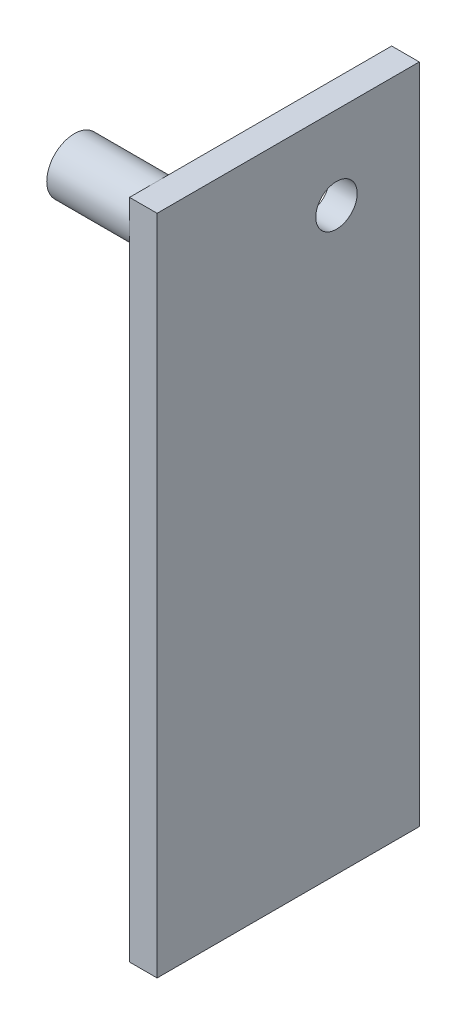
ISO-10303-21;
HEADER;
FILE_DESCRIPTION(('STEP AP214'),'2;1');
FILE_NAME('part.step','',(''),(''),'','','');
FILE_SCHEMA(('AUTOMOTIVE_DESIGN { 1 0 10303 214 1 1 1 1 }'));
ENDSEC;
DATA;
#1=APPLICATION_CONTEXT('core data for automotive mechanical design processes');
#2=APPLICATION_PROTOCOL_DEFINITION('international standard','automotive_design',2000,#1);
#3=PRODUCT_CONTEXT('',#1,'mechanical');
#4=PRODUCT('Part','Part','',(#3));
#5=PRODUCT_RELATED_PRODUCT_CATEGORY('part','',(#4));
#6=PRODUCT_DEFINITION_FORMATION('','',#4);
#7=PRODUCT_DEFINITION_CONTEXT('part definition',#1,'design');
#8=PRODUCT_DEFINITION('design','',#6,#7);
#9=PRODUCT_DEFINITION_SHAPE('','',#8);
#10=(LENGTH_UNIT() NAMED_UNIT(*) SI_UNIT(.MILLI.,.METRE.));
#11=(NAMED_UNIT(*) PLANE_ANGLE_UNIT() SI_UNIT($,.RADIAN.));
#12=(NAMED_UNIT(*) SI_UNIT($,.STERADIAN.) SOLID_ANGLE_UNIT());
#13=UNCERTAINTY_MEASURE_WITH_UNIT(LENGTH_MEASURE(1.E-05),#10,'distance_accuracy_value','');
#14=(GEOMETRIC_REPRESENTATION_CONTEXT(3) GLOBAL_UNCERTAINTY_ASSIGNED_CONTEXT((#13)) GLOBAL_UNIT_ASSIGNED_CONTEXT((#10,
#11,#12)) REPRESENTATION_CONTEXT('',''));
#15=CARTESIAN_POINT('',(0.,0.,0.));
#16=DIRECTION('',(0.,0.,1.));
#17=DIRECTION('',(1.,0.,0.));
#18=AXIS2_PLACEMENT_3D('',#15,#16,#17);
#19=CARTESIAN_POINT('',(0.,0.,0.));
#20=DIRECTION('',(-1.,0.,0.));
#21=DIRECTION('',(0.,0.,1.));
#22=AXIS2_PLACEMENT_3D('',#19,#20,#21);
#23=PLANE('',#22);
#24=CARTESIAN_POINT('',(0.,46.,17.));
#25=DIRECTION('',(-1.,0.,0.));
#26=DIRECTION('',(0.,0.,1.));
#27=AXIS2_PLACEMENT_3D('',#24,#25,#26);
#28=CIRCLE('',#27,2.);
#29=CARTESIAN_POINT('',(0.,46.,19.));
#30=VERTEX_POINT('',#29);
#31=CARTESIAN_POINT('',(0.,48.,17.));
#32=VERTEX_POINT('',#31);
#33=EDGE_CURVE('E50',#30,#32,#28,.T.);
#34=ORIENTED_EDGE('',*,*,#33,.F.);
#35=DIRECTION('',(0.,-1.,0.));
#36=VECTOR('',#35,1.);
#37=CARTESIAN_POINT('',(0.,0.,19.));
#38=LINE('',#37,#36);
#39=CARTESIAN_POINT('',(0.,48.,19.));
#40=VERTEX_POINT('',#39);
#41=EDGE_CURVE('E135',#40,#30,#38,.T.);
#42=ORIENTED_EDGE('',*,*,#41,.F.);
#43=DIRECTION('',(0.,0.,1.));
#44=VECTOR('',#43,1.);
#45=CARTESIAN_POINT('',(0.,48.,0.));
#46=LINE('',#45,#44);
#47=EDGE_CURVE('E103',#32,#40,#46,.T.);
#48=ORIENTED_EDGE('',*,*,#47,.F.);
#49=EDGE_LOOP('',(#34,#42,#48));
#50=FACE_BOUND('',#49,.T.);
#51=ADVANCED_FACE('F39',(#50),#23,.T.);
#52=CARTESIAN_POINT('',(0.,2.,2.));
#53=DIRECTION('',(-1.,0.,0.));
#54=DIRECTION('',(0.,0.,1.));
#55=AXIS2_PLACEMENT_3D('',#52,#53,#54);
#56=CIRCLE('',#55,2.);
#57=CARTESIAN_POINT('',(0.,2.,0.));
#58=VERTEX_POINT('',#57);
#59=CARTESIAN_POINT('',(0.,0.,2.));
#60=VERTEX_POINT('',#59);
#61=EDGE_CURVE('E110',#58,#60,#56,.T.);
#62=ORIENTED_EDGE('',*,*,#61,.F.);
#63=DIRECTION('',(0.,1.,0.));
#64=VECTOR('',#63,1.);
#65=CARTESIAN_POINT('',(0.,0.,0.));
#66=LINE('',#65,#64);
#67=CARTESIAN_POINT('',(0.,0.,0.));
#68=VERTEX_POINT('',#67);
#69=EDGE_CURVE('E95',#68,#58,#66,.T.);
#70=ORIENTED_EDGE('',*,*,#69,.F.);
#71=DIRECTION('',(0.,0.,-1.));
#72=VECTOR('',#71,1.);
#73=CARTESIAN_POINT('',(0.,0.,0.));
#74=LINE('',#73,#72);
#75=EDGE_CURVE('E112',#60,#68,#74,.T.);
#76=ORIENTED_EDGE('',*,*,#75,.F.);
#77=EDGE_LOOP('',(#62,#70,#76));
#78=FACE_BOUND('',#77,.T.);
#79=ADVANCED_FACE('F111',(#78),#23,.T.);
#80=CARTESIAN_POINT('',(2.,0.,0.));
#81=DIRECTION('',(0.,1.,0.));
#82=DIRECTION('',(0.,0.,1.));
#83=AXIS2_PLACEMENT_3D('',#80,#81,#82);
#84=PLANE('',#83);
#85=CARTESIAN_POINT('',(0.,0.,19.));
#86=VERTEX_POINT('',#85);
#87=EDGE_CURVE('E108',#86,#60,#74,.T.);
#88=ORIENTED_EDGE('',*,*,#87,.T.);
#89=ORIENTED_EDGE('',*,*,#75,.T.);
#90=DIRECTION('',(-1.,0.,0.));
#91=VECTOR('',#90,1.);
#92=CARTESIAN_POINT('',(2.,0.,0.));
#93=LINE('',#92,#91);
#94=CARTESIAN_POINT('',(2.,0.,0.));
#95=VERTEX_POINT('',#94);
#96=EDGE_CURVE('E43',#95,#68,#93,.T.);
#97=ORIENTED_EDGE('',*,*,#96,.F.);
#98=DIRECTION('',(0.,0.,-1.));
#99=VECTOR('',#98,1.);
#100=CARTESIAN_POINT('',(2.,0.,0.));
#101=LINE('',#100,#99);
#102=CARTESIAN_POINT('',(2.,0.,19.));
#103=VERTEX_POINT('',#102);
#104=EDGE_CURVE('E131',#103,#95,#101,.T.);
#105=ORIENTED_EDGE('',*,*,#104,.F.);
#106=DIRECTION('',(-1.,0.,0.));
#107=VECTOR('',#106,1.);
#108=CARTESIAN_POINT('',(2.,0.,19.));
#109=LINE('',#108,#107);
#110=EDGE_CURVE('E141',#103,#86,#109,.T.);
#111=ORIENTED_EDGE('',*,*,#110,.T.);
#112=EDGE_LOOP('',(#88,#89,#97,#105,#111));
#113=FACE_BOUND('',#112,.T.);
#114=ADVANCED_FACE('F41',(#113),#84,.F.);
#115=CARTESIAN_POINT('',(2.,0.,0.));
#116=DIRECTION('',(0.,0.,1.));
#117=DIRECTION('',(1.,0.,0.));
#118=AXIS2_PLACEMENT_3D('',#115,#116,#117);
#119=PLANE('',#118);
#120=ORIENTED_EDGE('',*,*,#69,.T.);
#121=CARTESIAN_POINT('',(0.,48.,0.));
#122=VERTEX_POINT('',#121);
#123=EDGE_CURVE('E98',#58,#122,#66,.T.);
#124=ORIENTED_EDGE('',*,*,#123,.T.);
#125=DIRECTION('',(-1.,0.,0.));
#126=VECTOR('',#125,1.);
#127=CARTESIAN_POINT('',(2.,48.,0.));
#128=LINE('',#127,#126);
#129=CARTESIAN_POINT('',(2.,48.,0.));
#130=VERTEX_POINT('',#129);
#131=EDGE_CURVE('E119',#130,#122,#128,.T.);
#132=ORIENTED_EDGE('',*,*,#131,.F.);
#133=DIRECTION('',(0.,1.,0.));
#134=VECTOR('',#133,1.);
#135=CARTESIAN_POINT('',(2.,0.,0.));
#136=LINE('',#135,#134);
#137=EDGE_CURVE('E134',#95,#130,#136,.T.);
#138=ORIENTED_EDGE('',*,*,#137,.F.);
#139=ORIENTED_EDGE('',*,*,#96,.T.);
#140=EDGE_LOOP('',(#120,#124,#132,#138,#139));
#141=FACE_BOUND('',#140,.T.);
#142=ADVANCED_FACE('F96',(#141),#119,.F.);
#143=CARTESIAN_POINT('',(2.,48.,0.));
#144=DIRECTION('',(0.,-1.,0.));
#145=DIRECTION('',(0.,0.,-1.));
#146=AXIS2_PLACEMENT_3D('',#143,#144,#145);
#147=PLANE('',#146);
#148=EDGE_CURVE('E107',#122,#32,#46,.T.);
#149=ORIENTED_EDGE('',*,*,#148,.T.);
#150=ORIENTED_EDGE('',*,*,#47,.T.);
#151=DIRECTION('',(-1.,0.,0.));
#152=VECTOR('',#151,1.);
#153=CARTESIAN_POINT('',(2.,48.,19.));
#154=LINE('',#153,#152);
#155=CARTESIAN_POINT('',(2.,48.,19.));
#156=VERTEX_POINT('',#155);
#157=EDGE_CURVE('E148',#156,#40,#154,.T.);
#158=ORIENTED_EDGE('',*,*,#157,.F.);
#159=DIRECTION('',(0.,0.,1.));
#160=VECTOR('',#159,1.);
#161=CARTESIAN_POINT('',(2.,48.,0.));
#162=LINE('',#161,#160);
#163=EDGE_CURVE('E137',#130,#156,#162,.T.);
#164=ORIENTED_EDGE('',*,*,#163,.F.);
#165=ORIENTED_EDGE('',*,*,#131,.T.);
#166=EDGE_LOOP('',(#149,#150,#158,#164,#165));
#167=FACE_BOUND('',#166,.T.);
#168=ADVANCED_FACE('F152',(#167),#147,.F.);
#169=CARTESIAN_POINT('',(2.,0.,19.));
#170=DIRECTION('',(0.,0.,-1.));
#171=DIRECTION('',(-1.,0.,0.));
#172=AXIS2_PLACEMENT_3D('',#169,#170,#171);
#173=PLANE('',#172);
#174=ORIENTED_EDGE('',*,*,#41,.T.);
#175=EDGE_CURVE('E144',#30,#86,#38,.T.);
#176=ORIENTED_EDGE('',*,*,#175,.T.);
#177=ORIENTED_EDGE('',*,*,#110,.F.);
#178=DIRECTION('',(0.,-1.,0.));
#179=VECTOR('',#178,1.);
#180=CARTESIAN_POINT('',(2.,0.,19.));
#181=LINE('',#180,#179);
#182=EDGE_CURVE('E139',#156,#103,#181,.T.);
#183=ORIENTED_EDGE('',*,*,#182,.F.);
#184=ORIENTED_EDGE('',*,*,#157,.T.);
#185=EDGE_LOOP('',(#174,#176,#177,#183,#184));
#186=FACE_BOUND('',#185,.T.);
#187=ADVANCED_FACE('F191',(#186),#173,.F.);
#188=CARTESIAN_POINT('',(2.,0.,0.));
#189=DIRECTION('',(-1.,0.,0.));
#190=DIRECTION('',(0.,0.,1.));
#191=AXIS2_PLACEMENT_3D('',#188,#189,#190);
#192=PLANE('',#191);
#193=CARTESIAN_POINT('',(2.,42.,6.));
#194=DIRECTION('',(-1.,0.,0.));
#195=DIRECTION('',(0.,0.,1.));
#196=AXIS2_PLACEMENT_3D('',#193,#194,#195);
#197=CIRCLE('',#196,1.5);
#198=CARTESIAN_POINT('',(2.,42.,7.5));
#199=VERTEX_POINT('',#198);
#200=EDGE_CURVE('E124',#199,#199,#197,.F.);
#201=ORIENTED_EDGE('',*,*,#200,.F.);
#202=EDGE_LOOP('',(#201));
#203=FACE_BOUND('',#202,.T.);
#204=ORIENTED_EDGE('',*,*,#104,.T.);
#205=ORIENTED_EDGE('',*,*,#137,.T.);
#206=ORIENTED_EDGE('',*,*,#163,.T.);
#207=ORIENTED_EDGE('',*,*,#182,.T.);
#208=EDGE_LOOP('',(#204,#205,#206,#207));
#209=FACE_BOUND('',#208,.T.);
#210=ADVANCED_FACE('F157',(#203,#209),#192,.F.);
#211=CARTESIAN_POINT('',(0.,42.,6.));
#212=DIRECTION('',(-1.,0.,0.));
#213=DIRECTION('',(0.,0.,1.));
#214=AXIS2_PLACEMENT_3D('',#211,#212,#213);
#215=CIRCLE('',#214,1.5);
#216=CARTESIAN_POINT('',(0.,42.,7.5));
#217=VERTEX_POINT('',#216);
#218=EDGE_CURVE('E173',#217,#217,#215,.T.);
#219=ORIENTED_EDGE('',*,*,#218,.F.);
#220=EDGE_LOOP('',(#219));
#221=FACE_BOUND('',#220,.T.);
#222=EDGE_CURVE('E11',#32,#30,#28,.T.);
#223=ORIENTED_EDGE('',*,*,#222,.F.);
#224=ORIENTED_EDGE('',*,*,#148,.F.);
#225=ORIENTED_EDGE('',*,*,#123,.F.);
#226=EDGE_CURVE('E48',#60,#58,#56,.T.);
#227=ORIENTED_EDGE('',*,*,#226,.F.);
#228=ORIENTED_EDGE('',*,*,#87,.F.);
#229=ORIENTED_EDGE('',*,*,#175,.F.);
#230=EDGE_LOOP('',(#223,#224,#225,#227,#228,#229));
#231=FACE_BOUND('',#230,.T.);
#232=ADVANCED_FACE('F105',(#221,#231),#23,.T.);
#233=CARTESIAN_POINT('',(-6.,2.,2.));
#234=DIRECTION('',(-1.,0.,0.));
#235=DIRECTION('',(0.,0.,1.));
#236=AXIS2_PLACEMENT_3D('',#233,#234,#235);
#237=PLANE('',#236);
#238=CARTESIAN_POINT('',(-6.,2.,2.));
#239=DIRECTION('',(-1.,0.,0.));
#240=DIRECTION('',(0.,0.,1.));
#241=AXIS2_PLACEMENT_3D('',#238,#239,#240);
#242=CIRCLE('',#241,2.);
#243=CARTESIAN_POINT('',(-6.,2.,4.));
#244=VERTEX_POINT('',#243);
#245=EDGE_CURVE('E116',#244,#244,#242,.T.);
#246=ORIENTED_EDGE('',*,*,#245,.T.);
#247=EDGE_LOOP('',(#246));
#248=FACE_BOUND('',#247,.T.);
#249=CARTESIAN_POINT('',(-6.,2.,2.));
#250=DIRECTION('',(-1.,0.,0.));
#251=DIRECTION('',(0.,0.,1.));
#252=AXIS2_PLACEMENT_3D('',#249,#250,#251);
#253=CIRCLE('',#252,1.);
#254=CARTESIAN_POINT('',(-6.,2.,3.));
#255=VERTEX_POINT('',#254);
#256=EDGE_CURVE('E115',#255,#255,#253,.T.);
#257=ORIENTED_EDGE('',*,*,#256,.F.);
#258=EDGE_LOOP('',(#257));
#259=FACE_BOUND('',#258,.T.);
#260=ADVANCED_FACE('F181',(#248,#259),#237,.T.);
#261=CARTESIAN_POINT('',(-6.,2.,2.));
#262=DIRECTION('',(1.,0.,0.));
#263=DIRECTION('',(0.,0.,-1.));
#264=AXIS2_PLACEMENT_3D('',#261,#262,#263);
#265=CYLINDRICAL_SURFACE('',#264,2.);
#266=ORIENTED_EDGE('',*,*,#245,.F.);
#267=EDGE_LOOP('',(#266));
#268=FACE_BOUND('',#267,.T.);
#269=ORIENTED_EDGE('',*,*,#61,.T.);
#270=ORIENTED_EDGE('',*,*,#226,.T.);
#271=EDGE_LOOP('',(#269,#270));
#272=FACE_BOUND('',#271,.T.);
#273=ADVANCED_FACE('F118',(#268,#272),#265,.T.);
#274=CARTESIAN_POINT('',(-6.,2.,2.));
#275=DIRECTION('',(1.,0.,0.));
#276=DIRECTION('',(0.,0.,-1.));
#277=AXIS2_PLACEMENT_3D('',#274,#275,#276);
#278=CYLINDRICAL_SURFACE('',#277,1.);
#279=ORIENTED_EDGE('',*,*,#256,.T.);
#280=EDGE_LOOP('',(#279));
#281=FACE_BOUND('',#280,.T.);
#282=CARTESIAN_POINT('',(0.,2.,2.));
#283=DIRECTION('',(-1.,0.,0.));
#284=DIRECTION('',(0.,0.,1.));
#285=AXIS2_PLACEMENT_3D('',#282,#283,#284);
#286=CIRCLE('',#285,1.);
#287=CARTESIAN_POINT('',(0.,2.,3.));
#288=VERTEX_POINT('',#287);
#289=EDGE_CURVE('E125',#288,#288,#286,.T.);
#290=ORIENTED_EDGE('',*,*,#289,.F.);
#291=EDGE_LOOP('',(#290));
#292=FACE_BOUND('',#291,.T.);
#293=ADVANCED_FACE('F234',(#281,#292),#278,.F.);
#294=CARTESIAN_POINT('',(-6.,46.,17.));
#295=DIRECTION('',(-1.,0.,0.));
#296=DIRECTION('',(0.,0.,1.));
#297=AXIS2_PLACEMENT_3D('',#294,#295,#296);
#298=PLANE('',#297);
#299=CARTESIAN_POINT('',(-6.,46.,17.));
#300=DIRECTION('',(-1.,0.,0.));
#301=DIRECTION('',(0.,0.,1.));
#302=AXIS2_PLACEMENT_3D('',#299,#300,#301);
#303=CIRCLE('',#302,2.);
#304=CARTESIAN_POINT('',(-6.,46.,19.));
#305=VERTEX_POINT('',#304);
#306=EDGE_CURVE('E161',#305,#305,#303,.T.);
#307=ORIENTED_EDGE('',*,*,#306,.T.);
#308=EDGE_LOOP('',(#307));
#309=FACE_BOUND('',#308,.T.);
#310=CARTESIAN_POINT('',(-6.,46.,17.));
#311=DIRECTION('',(-1.,0.,0.));
#312=DIRECTION('',(0.,0.,1.));
#313=AXIS2_PLACEMENT_3D('',#310,#311,#312);
#314=CIRCLE('',#313,0.999999999999998);
#315=CARTESIAN_POINT('',(-6.,46.,18.));
#316=VERTEX_POINT('',#315);
#317=EDGE_CURVE('E165',#316,#316,#314,.T.);
#318=ORIENTED_EDGE('',*,*,#317,.F.);
#319=EDGE_LOOP('',(#318));
#320=FACE_BOUND('',#319,.T.);
#321=ADVANCED_FACE('F228',(#309,#320),#298,.T.);
#322=CARTESIAN_POINT('',(-6.,46.,17.));
#323=DIRECTION('',(1.,0.,0.));
#324=DIRECTION('',(0.,0.,-1.));
#325=AXIS2_PLACEMENT_3D('',#322,#323,#324);
#326=CYLINDRICAL_SURFACE('',#325,2.);
#327=ORIENTED_EDGE('',*,*,#306,.F.);
#328=EDGE_LOOP('',(#327));
#329=FACE_BOUND('',#328,.T.);
#330=ORIENTED_EDGE('',*,*,#33,.T.);
#331=ORIENTED_EDGE('',*,*,#222,.T.);
#332=EDGE_LOOP('',(#330,#331));
#333=FACE_BOUND('',#332,.T.);
#334=ADVANCED_FACE('F206',(#329,#333),#326,.T.);
#335=CARTESIAN_POINT('',(-6.,46.,17.));
#336=DIRECTION('',(1.,0.,0.));
#337=DIRECTION('',(0.,0.,-1.));
#338=AXIS2_PLACEMENT_3D('',#335,#336,#337);
#339=CYLINDRICAL_SURFACE('',#338,0.999999999999998);
#340=ORIENTED_EDGE('',*,*,#317,.T.);
#341=EDGE_LOOP('',(#340));
#342=FACE_BOUND('',#341,.T.);
#343=CARTESIAN_POINT('',(0.,46.,17.));
#344=DIRECTION('',(-1.,0.,0.));
#345=DIRECTION('',(0.,0.,1.));
#346=AXIS2_PLACEMENT_3D('',#343,#344,#345);
#347=CIRCLE('',#346,0.999999999999998);
#348=CARTESIAN_POINT('',(0.,46.,18.));
#349=VERTEX_POINT('',#348);
#350=EDGE_CURVE('E128',#349,#349,#347,.T.);
#351=ORIENTED_EDGE('',*,*,#350,.F.);
#352=EDGE_LOOP('',(#351));
#353=FACE_BOUND('',#352,.T.);
#354=ADVANCED_FACE('F199',(#342,#353),#339,.F.);
#355=ORIENTED_EDGE('',*,*,#289,.T.);
#356=EDGE_LOOP('',(#355));
#357=FACE_BOUND('',#356,.T.);
#358=ADVANCED_FACE('F183',(#357),#23,.T.);
#359=ORIENTED_EDGE('',*,*,#350,.T.);
#360=EDGE_LOOP('',(#359));
#361=FACE_BOUND('',#360,.T.);
#362=ADVANCED_FACE('F197',(#361),#23,.T.);
#363=CARTESIAN_POINT('',(2.001,42.,6.));
#364=DIRECTION('',(-1.,0.,0.));
#365=DIRECTION('',(0.,0.,1.));
#366=AXIS2_PLACEMENT_3D('',#363,#364,#365);
#367=CYLINDRICAL_SURFACE('',#366,1.5);
#368=ORIENTED_EDGE('',*,*,#218,.T.);
#369=EDGE_LOOP('',(#368));
#370=FACE_BOUND('',#369,.T.);
#371=ORIENTED_EDGE('',*,*,#200,.T.);
#372=EDGE_LOOP('',(#371));
#373=FACE_BOUND('',#372,.T.);
#374=ADVANCED_FACE('F177',(#370,#373),#367,.F.);
#375=CLOSED_SHELL('',(#51,#79,#114,#142,#168,#187,#210,#232,#260,#273,#293,#321,#334,#354,#358,
#362,#374));
#376=MANIFOLD_SOLID_BREP('B2',#375);
#377=ADVANCED_BREP_SHAPE_REPRESENTATION('',(#18,#376),#14);
#378=SHAPE_DEFINITION_REPRESENTATION(#9,#377);
ENDSEC;
END-ISO-10303-21;
